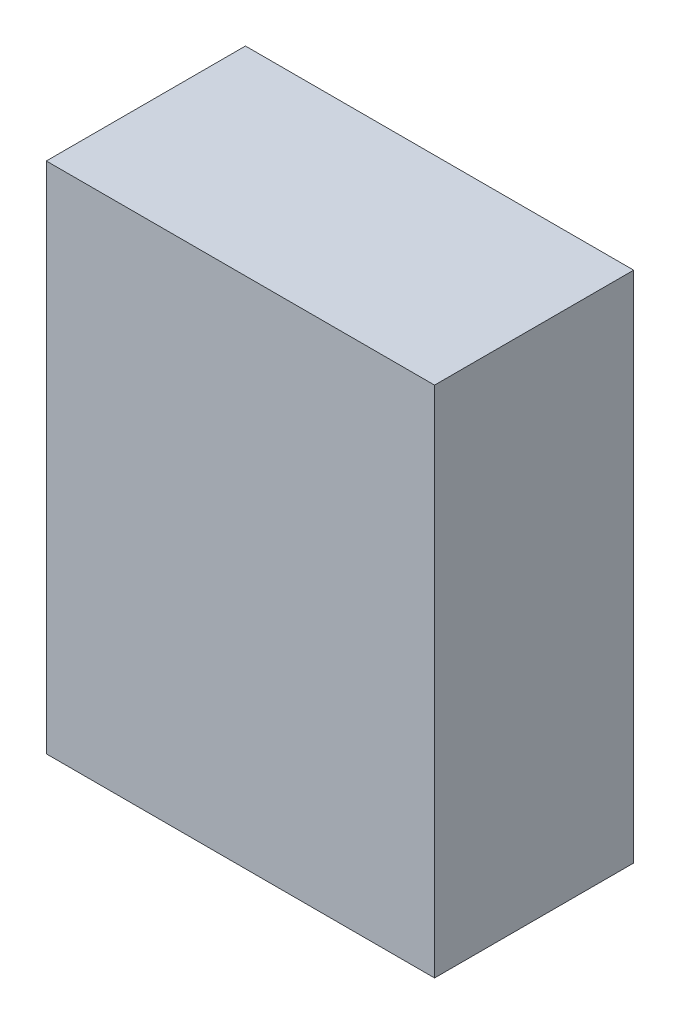
ISO-10303-21;
HEADER;
FILE_DESCRIPTION(('STEP AP214'),'2;1');
FILE_NAME('part.step','',(''),(''),'','','');
FILE_SCHEMA(('AUTOMOTIVE_DESIGN { 1 0 10303 214 1 1 1 1 }'));
ENDSEC;
DATA;
#1=APPLICATION_CONTEXT('core data for automotive mechanical design processes');
#2=APPLICATION_PROTOCOL_DEFINITION('international standard','automotive_design',2000,#1);
#3=PRODUCT_CONTEXT('',#1,'mechanical');
#4=PRODUCT('Part','Part','',(#3));
#5=PRODUCT_RELATED_PRODUCT_CATEGORY('part','',(#4));
#6=PRODUCT_DEFINITION_FORMATION('','',#4);
#7=PRODUCT_DEFINITION_CONTEXT('part definition',#1,'design');
#8=PRODUCT_DEFINITION('design','',#6,#7);
#9=PRODUCT_DEFINITION_SHAPE('','',#8);
#10=(LENGTH_UNIT() NAMED_UNIT(*) SI_UNIT(.MILLI.,.METRE.));
#11=(NAMED_UNIT(*) PLANE_ANGLE_UNIT() SI_UNIT($,.RADIAN.));
#12=(NAMED_UNIT(*) SI_UNIT($,.STERADIAN.) SOLID_ANGLE_UNIT());
#13=UNCERTAINTY_MEASURE_WITH_UNIT(LENGTH_MEASURE(1.E-05),#10,'distance_accuracy_value','');
#14=(GEOMETRIC_REPRESENTATION_CONTEXT(3) GLOBAL_UNCERTAINTY_ASSIGNED_CONTEXT((#13)) GLOBAL_UNIT_ASSIGNED_CONTEXT((#10,
#11,#12)) REPRESENTATION_CONTEXT('',''));
#15=CARTESIAN_POINT('',(0.,0.,0.));
#16=DIRECTION('',(0.,0.,1.));
#17=DIRECTION('',(1.,0.,0.));
#18=AXIS2_PLACEMENT_3D('',#15,#16,#17);
#19=CARTESIAN_POINT('',(-4.86947368554924,20.8893010871061,-0.699999030283086));
#20=DIRECTION('',(0.,8.74227339409095E-08,-1.));
#21=DIRECTION('',(1.,0.,0.));
#22=AXIS2_PLACEMENT_3D('',#19,#20,#21);
#23=PLANE('',#22);
#24=CARTESIAN_POINT('',(-4.86947368554924,20.8893010871061,-0.699999030283086));
#25=DIRECTION('',(0.,8.74227339409095E-08,-1.));
#26=DIRECTION('',(1.,0.,0.));
#27=AXIS2_PLACEMENT_3D('',#24,#25,#26);
#28=CIRCLE('',#27,0.096875);
#29=CARTESIAN_POINT('',(-4.77259868554924,20.8893010871061,-0.699999030283086));
#30=VERTEX_POINT('',#29);
#31=EDGE_CURVE('E11',#30,#30,#28,.T.);
#32=ORIENTED_EDGE('',*,*,#31,.T.);
#33=EDGE_LOOP('',(#32));
#34=FACE_BOUND('',#33,.T.);
#35=ADVANCED_FACE('F17',(#34),#23,.T.);
#36=CARTESIAN_POINT('',(-4.86947368554924,20.8893010871061,-0.699999030283086));
#37=DIRECTION('',(0.,8.74227339409095E-08,-1.));
#38=DIRECTION('',(1.,0.,0.));
#39=AXIS2_PLACEMENT_3D('',#36,#37,#38);
#40=CYLINDRICAL_SURFACE('',#39,0.096875);
#41=CARTESIAN_POINT('',(-4.86947368554924,20.8893010958484,-0.799999030283086));
#42=DIRECTION('',(0.,8.74227339409095E-08,-1.));
#43=DIRECTION('',(1.,0.,0.));
#44=AXIS2_PLACEMENT_3D('',#41,#42,#43);
#45=CIRCLE('',#44,0.096875);
#46=CARTESIAN_POINT('',(-4.77259868554924,20.8893010958484,-0.799999030283086));
#47=VERTEX_POINT('',#46);
#48=EDGE_CURVE('E111',#47,#47,#45,.T.);
#49=ORIENTED_EDGE('',*,*,#48,.T.);
#50=EDGE_LOOP('',(#49));
#51=FACE_BOUND('',#50,.T.);
#52=ORIENTED_EDGE('',*,*,#31,.F.);
#53=EDGE_LOOP('',(#52));
#54=FACE_BOUND('',#53,.T.);
#55=ADVANCED_FACE('F169',(#51,#54),#40,.F.);
#56=CARTESIAN_POINT('',(-3.57780701888225,22.6809676930143,-0.0049988736506891));
#57=DIRECTION('',(1.,0.,0.));
#58=DIRECTION('',(0.,8.74227339409095E-08,-1.));
#59=AXIS2_PLACEMENT_3D('',#56,#57,#58);
#60=PLANE('',#59);
#61=DIRECTION('',(0.,8.74227339409095E-08,-1.));
#62=VECTOR('',#61,1.);
#63=CARTESIAN_POINT('',(-3.57780701888225,22.6809676930143,-0.0049988736506891));
#64=LINE('',#63,#62);
#65=CARTESIAN_POINT('',(-3.57780701888225,22.6809676930143,-0.0049988736506891));
#66=VERTEX_POINT('',#65);
#67=CARTESIAN_POINT('',(-3.57780701888225,22.6809677625154,-0.799998873650688));
#68=VERTEX_POINT('',#67);
#69=EDGE_CURVE('E76',#66,#68,#64,.T.);
#70=ORIENTED_EDGE('',*,*,#69,.F.);
#71=DIRECTION('',(0.,-1.,-8.74227339409095E-08));
#72=VECTOR('',#71,1.);
#73=CARTESIAN_POINT('',(-3.57780701888225,22.6809676930143,-0.0049988736506891));
#74=LINE('',#73,#72);
#75=CARTESIAN_POINT('',(-3.57780701888225,20.6309676930144,-0.00499905286729377));
#76=VERTEX_POINT('',#75);
#77=EDGE_CURVE('E26',#66,#76,#74,.T.);
#78=ORIENTED_EDGE('',*,*,#77,.T.);
#79=DIRECTION('',(0.,8.74227339409095E-08,-1.));
#80=VECTOR('',#79,1.);
#81=CARTESIAN_POINT('',(-3.57780701888225,20.6309676930144,-0.00499905286729377));
#82=LINE('',#81,#80);
#83=CARTESIAN_POINT('',(-3.57780701888225,20.6309677625154,-0.799999052867292));
#84=VERTEX_POINT('',#83);
#85=EDGE_CURVE('E71',#76,#84,#82,.T.);
#86=ORIENTED_EDGE('',*,*,#85,.T.);
#87=DIRECTION('',(0.,-1.,-8.74227339409095E-08));
#88=VECTOR('',#87,1.);
#89=CARTESIAN_POINT('',(-3.57780701888225,22.6809677625154,-0.799998873650688));
#90=LINE('',#89,#88);
#91=EDGE_CURVE('E81',#68,#84,#90,.T.);
#92=ORIENTED_EDGE('',*,*,#91,.F.);
#93=EDGE_LOOP('',(#70,#78,#86,#92));
#94=FACE_BOUND('',#93,.T.);
#95=ADVANCED_FACE('F84',(#94),#60,.T.);
#96=CARTESIAN_POINT('',(-5.12780701888224,22.6809676930143,-0.0049988736506891));
#97=DIRECTION('',(0.,8.74227339409095E-08,-1.));
#98=DIRECTION('',(1.,0.,0.));
#99=AXIS2_PLACEMENT_3D('',#96,#97,#98);
#100=PLANE('',#99);
#101=DIRECTION('',(1.,0.,0.));
#102=VECTOR('',#101,1.);
#103=CARTESIAN_POINT('',(-5.12780701888224,20.6309676930144,-0.00499905286729377));
#104=LINE('',#103,#102);
#105=CARTESIAN_POINT('',(-5.12780701888224,20.6309676930144,-0.00499905286729377));
#106=VERTEX_POINT('',#105);
#107=EDGE_CURVE('E69',#106,#76,#104,.T.);
#108=ORIENTED_EDGE('',*,*,#107,.T.);
#109=ORIENTED_EDGE('',*,*,#77,.F.);
#110=DIRECTION('',(1.,0.,0.));
#111=VECTOR('',#110,1.);
#112=CARTESIAN_POINT('',(-5.12780701888224,22.6809676930143,-0.0049988736506891));
#113=LINE('',#112,#111);
#114=CARTESIAN_POINT('',(-5.12780701888224,22.6809676930143,-0.0049988736506891));
#115=VERTEX_POINT('',#114);
#116=EDGE_CURVE('E64',#115,#66,#113,.T.);
#117=ORIENTED_EDGE('',*,*,#116,.F.);
#118=DIRECTION('',(0.,-1.,-8.74227339409095E-08));
#119=VECTOR('',#118,1.);
#120=CARTESIAN_POINT('',(-5.12780701888224,22.6809676930143,-0.0049988736506891));
#121=LINE('',#120,#119);
#122=EDGE_CURVE('E93',#115,#106,#121,.T.);
#123=ORIENTED_EDGE('',*,*,#122,.T.);
#124=EDGE_LOOP('',(#108,#109,#117,#123));
#125=FACE_BOUND('',#124,.T.);
#126=ADVANCED_FACE('F68',(#125),#100,.F.);
#127=CARTESIAN_POINT('',(-5.12780701888224,20.6309676930144,-0.00499905286729377));
#128=DIRECTION('',(0.,-1.,-8.74227339409095E-08));
#129=DIRECTION('',(0.,8.74227339409095E-08,-1.));
#130=AXIS2_PLACEMENT_3D('',#127,#128,#129);
#131=PLANE('',#130);
#132=ORIENTED_EDGE('',*,*,#107,.F.);
#133=DIRECTION('',(0.,8.74227339409095E-08,-1.));
#134=VECTOR('',#133,1.);
#135=CARTESIAN_POINT('',(-5.12780701888224,20.6309676930144,-0.00499905286729377));
#136=LINE('',#135,#134);
#137=CARTESIAN_POINT('',(-5.12780701888224,20.6309677625154,-0.799999052867292));
#138=VERTEX_POINT('',#137);
#139=EDGE_CURVE('E135',#106,#138,#136,.T.);
#140=ORIENTED_EDGE('',*,*,#139,.T.);
#141=DIRECTION('',(1.,0.,0.));
#142=VECTOR('',#141,1.);
#143=CARTESIAN_POINT('',(-5.12780701888224,20.6309677625154,-0.799999052867292));
#144=LINE('',#143,#142);
#145=EDGE_CURVE('E109',#138,#84,#144,.T.);
#146=ORIENTED_EDGE('',*,*,#145,.T.);
#147=ORIENTED_EDGE('',*,*,#85,.F.);
#148=EDGE_LOOP('',(#132,#140,#146,#147));
#149=FACE_BOUND('',#148,.T.);
#150=ADVANCED_FACE('F158',(#149),#131,.T.);
#151=CARTESIAN_POINT('',(-5.12780701888224,22.6809677625154,-0.799998873650688));
#152=DIRECTION('',(0.,8.74227339409095E-08,-1.));
#153=DIRECTION('',(1.,0.,0.));
#154=AXIS2_PLACEMENT_3D('',#151,#152,#153);
#155=PLANE('',#154);
#156=ORIENTED_EDGE('',*,*,#48,.F.);
#157=EDGE_LOOP('',(#156));
#158=FACE_BOUND('',#157,.T.);
#159=DIRECTION('',(0.,-1.,-8.74227339409095E-08));
#160=VECTOR('',#159,1.);
#161=CARTESIAN_POINT('',(-5.12780701888224,22.6809677625154,-0.799998873650688));
#162=LINE('',#161,#160);
#163=CARTESIAN_POINT('',(-5.12780701888224,22.6809677625154,-0.799998873650688));
#164=VERTEX_POINT('',#163);
#165=EDGE_CURVE('E139',#164,#138,#162,.T.);
#166=ORIENTED_EDGE('',*,*,#165,.F.);
#167=DIRECTION('',(1.,0.,0.));
#168=VECTOR('',#167,1.);
#169=CARTESIAN_POINT('',(-5.12780701888224,22.6809677625154,-0.799998873650688));
#170=LINE('',#169,#168);
#171=EDGE_CURVE('E82',#164,#68,#170,.T.);
#172=ORIENTED_EDGE('',*,*,#171,.T.);
#173=ORIENTED_EDGE('',*,*,#91,.T.);
#174=ORIENTED_EDGE('',*,*,#145,.F.);
#175=EDGE_LOOP('',(#166,#172,#173,#174));
#176=FACE_BOUND('',#175,.T.);
#177=ADVANCED_FACE('F156',(#158,#176),#155,.T.);
#178=CARTESIAN_POINT('',(-5.12780701888224,22.6809676930143,-0.0049988736506891));
#179=DIRECTION('',(0.,-1.,-8.74227339409095E-08));
#180=DIRECTION('',(0.,8.74227339409095E-08,-1.));
#181=AXIS2_PLACEMENT_3D('',#178,#179,#180);
#182=PLANE('',#181);
#183=ORIENTED_EDGE('',*,*,#69,.T.);
#184=ORIENTED_EDGE('',*,*,#171,.F.);
#185=DIRECTION('',(0.,8.74227339409095E-08,-1.));
#186=VECTOR('',#185,1.);
#187=CARTESIAN_POINT('',(-5.12780701888224,22.6809676930143,-0.0049988736506891));
#188=LINE('',#187,#186);
#189=EDGE_CURVE('E78',#115,#164,#188,.T.);
#190=ORIENTED_EDGE('',*,*,#189,.F.);
#191=ORIENTED_EDGE('',*,*,#116,.T.);
#192=EDGE_LOOP('',(#183,#184,#190,#191));
#193=FACE_BOUND('',#192,.T.);
#194=ADVANCED_FACE('F75',(#193),#182,.F.);
#195=CARTESIAN_POINT('',(-5.12780701888224,22.6809676930143,-0.0049988736506891));
#196=DIRECTION('',(1.,0.,0.));
#197=DIRECTION('',(0.,8.74227339409095E-08,-1.));
#198=AXIS2_PLACEMENT_3D('',#195,#196,#197);
#199=PLANE('',#198);
#200=ORIENTED_EDGE('',*,*,#165,.T.);
#201=ORIENTED_EDGE('',*,*,#139,.F.);
#202=ORIENTED_EDGE('',*,*,#122,.F.);
#203=ORIENTED_EDGE('',*,*,#189,.T.);
#204=EDGE_LOOP('',(#200,#201,#202,#203));
#205=FACE_BOUND('',#204,.T.);
#206=ADVANCED_FACE('F154',(#205),#199,.F.);
#207=CLOSED_SHELL('',(#35,#55,#95,#126,#150,#177,#194,#206));
#208=MANIFOLD_SOLID_BREP('B1',#207);
#209=ADVANCED_BREP_SHAPE_REPRESENTATION('',(#18,#208),#14);
#210=SHAPE_DEFINITION_REPRESENTATION(#9,#209);
ENDSEC;
END-ISO-10303-21;
